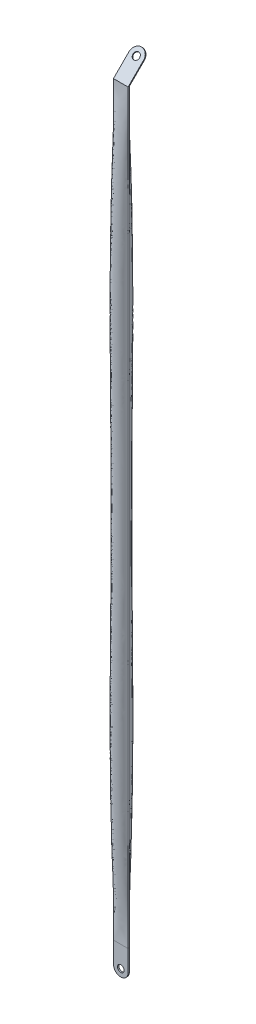
ISO-10303-21;
HEADER;
FILE_DESCRIPTION(('STEP AP214'),'2;1');
FILE_NAME('part.step','',(''),(''),'','','');
FILE_SCHEMA(('AUTOMOTIVE_DESIGN { 1 0 10303 214 1 1 1 1 }'));
ENDSEC;
DATA;
#1=APPLICATION_CONTEXT('core data for automotive mechanical design processes');
#2=APPLICATION_PROTOCOL_DEFINITION('international standard','automotive_design',2000,#1);
#3=PRODUCT_CONTEXT('',#1,'mechanical');
#4=PRODUCT('Part','Part','',(#3));
#5=PRODUCT_RELATED_PRODUCT_CATEGORY('part','',(#4));
#6=PRODUCT_DEFINITION_FORMATION('','',#4);
#7=PRODUCT_DEFINITION_CONTEXT('part definition',#1,'design');
#8=PRODUCT_DEFINITION('design','',#6,#7);
#9=PRODUCT_DEFINITION_SHAPE('','',#8);
#10=(LENGTH_UNIT() NAMED_UNIT(*) SI_UNIT(.MILLI.,.METRE.));
#11=(NAMED_UNIT(*) PLANE_ANGLE_UNIT() SI_UNIT($,.RADIAN.));
#12=(NAMED_UNIT(*) SI_UNIT($,.STERADIAN.) SOLID_ANGLE_UNIT());
#13=UNCERTAINTY_MEASURE_WITH_UNIT(LENGTH_MEASURE(1.E-05),#10,'distance_accuracy_value','');
#14=(GEOMETRIC_REPRESENTATION_CONTEXT(3) GLOBAL_UNCERTAINTY_ASSIGNED_CONTEXT((#13)) GLOBAL_UNIT_ASSIGNED_CONTEXT((#10,
#11,#12)) REPRESENTATION_CONTEXT('',''));
#15=CARTESIAN_POINT('',(0.,0.,0.));
#16=DIRECTION('',(0.,0.,1.));
#17=DIRECTION('',(1.,0.,0.));
#18=AXIS2_PLACEMENT_3D('',#15,#16,#17);
#19=CARTESIAN_POINT('',(13.97,711.2,-1.27));
#20=DIRECTION('',(0.,0.707107163928253,0.707106398444635));
#21=DIRECTION('',(0.,-0.707106398444635,0.707107163928253));
#22=AXIS2_PLACEMENT_3D('',#19,#20,#21);
#23=PLANE('',#22);
#24=DIRECTION('',(0.,0.707106398444635,-0.707107163928253));
#25=VECTOR('',#24,1.);
#26=CARTESIAN_POINT('',(-13.97,711.2,-1.27));
#27=LINE('',#26,#25);
#28=CARTESIAN_POINT('',(-13.97,711.2,-1.27));
#29=VERTEX_POINT('',#28);
#30=CARTESIAN_POINT('',(-13.97,739.487757606119,-29.5577882292547));
#31=VERTEX_POINT('',#30);
#32=EDGE_CURVE('E241',#29,#31,#27,.T.);
#33=ORIENTED_EDGE('',*,*,#32,.T.);
#34=CARTESIAN_POINT('',(0.,739.487757606119,-29.5577882292547));
#35=DIRECTION('',(0.,0.707107163928253,0.707106398444635));
#36=DIRECTION('',(0.,-0.707106398444635,0.707107163928253));
#37=AXIS2_PLACEMENT_3D('',#34,#35,#36);
#38=ELLIPSE('',#37,13.9700478904708,13.97);
#39=CARTESIAN_POINT('',(0.,749.366067856049,-39.4361091730274));
#40=VERTEX_POINT('',#39);
#41=EDGE_CURVE('E124',#31,#40,#38,.F.);
#42=ORIENTED_EDGE('',*,*,#41,.T.);
#43=CARTESIAN_POINT('',(0.,739.487757606119,-29.5577882292546));
#44=DIRECTION('',(0.,0.707107163928253,0.707106398444635));
#45=DIRECTION('',(0.,0.707106398444635,-0.707107163928253));
#46=AXIS2_PLACEMENT_3D('',#43,#44,#45);
#47=ELLIPSE('',#46,13.9700478904708,13.97);
#48=CARTESIAN_POINT('',(13.97,739.487757606119,-29.5577882292546));
#49=VERTEX_POINT('',#48);
#50=EDGE_CURVE('E132',#40,#49,#47,.F.);
#51=ORIENTED_EDGE('',*,*,#50,.T.);
#52=DIRECTION('',(0.,0.707106398444635,-0.707107163928253));
#53=VECTOR('',#52,1.);
#54=CARTESIAN_POINT('',(13.97,711.2,-1.27));
#55=LINE('',#54,#53);
#56=CARTESIAN_POINT('',(13.97,711.2,-1.27));
#57=VERTEX_POINT('',#56);
#58=EDGE_CURVE('E200',#57,#49,#55,.T.);
#59=ORIENTED_EDGE('',*,*,#58,.F.);
#60=DIRECTION('',(-1.,0.,0.));
#61=VECTOR('',#60,1.);
#62=CARTESIAN_POINT('',(13.97,711.2,-1.27));
#63=LINE('',#62,#61);
#64=CARTESIAN_POINT('',(13.9121529606312,711.2,-1.27));
#65=VERTEX_POINT('',#64);
#66=EDGE_CURVE('E205',#57,#65,#63,.T.);
#67=ORIENTED_EDGE('',*,*,#66,.T.);
#68=DIRECTION('',(-1.,0.,0.));
#69=VECTOR('',#68,1.);
#70=CARTESIAN_POINT('',(-13.9121529606312,711.2,-1.27));
#71=LINE('',#70,#69);
#72=CARTESIAN_POINT('',(-13.9121529606312,711.2,-1.27));
#73=VERTEX_POINT('',#72);
#74=EDGE_CURVE('E313',#65,#73,#71,.T.);
#75=ORIENTED_EDGE('',*,*,#74,.T.);
#76=EDGE_CURVE('E223',#73,#29,#63,.T.);
#77=ORIENTED_EDGE('',*,*,#76,.T.);
#78=EDGE_LOOP('',(#33,#42,#51,#59,#67,#75,#77));
#79=FACE_BOUND('',#78,.T.);
#80=CARTESIAN_POINT('',(0.,739.487757606119,-29.5577882292548));
#81=DIRECTION('',(0.,-0.707107163928253,-0.707106398444635));
#82=DIRECTION('',(0.,0.707106398444635,-0.707107163928253));
#83=AXIS2_PLACEMENT_3D('',#80,#81,#82);
#84=CIRCLE('',#83,6.34999999999999);
#85=CARTESIAN_POINT('',(0.,743.977883236243,-34.0479187201992));
#86=VERTEX_POINT('',#85);
#87=EDGE_CURVE('E252',#86,#86,#84,.T.);
#88=ORIENTED_EDGE('',*,*,#87,.F.);
#89=EDGE_LOOP('',(#88));
#90=FACE_BOUND('',#89,.T.);
#91=ADVANCED_FACE('F115',(#79,#90),#23,.F.);
#92=CARTESIAN_POINT('',(-13.9121529606312,711.2,1.27));
#93=CARTESIAN_POINT('',(-13.9116479341317,643.466666666667,1.269953897599));
#94=CARTESIAN_POINT('',(-13.9109754693789,406.509237608537,1.26989251024663));
#95=CARTESIAN_POINT('',(-13.9125902601457,3.54231790384775E-06,1.27003991980141));
#96=CARTESIAN_POINT('',(-13.9121058426015,-406.509251500024,1.26999569873203));
#97=CARTESIAN_POINT('',(-13.9121529606312,-643.466666666667,1.27));
#98=CARTESIAN_POINT('',(-13.9121529606312,-711.2,1.27));
#99=CARTESIAN_POINT('',(-13.9121529606312,711.2,0.423333333333333));
#100=CARTESIAN_POINT('',(-13.9116479341317,643.466666666667,0.423317965866331));
#101=CARTESIAN_POINT('',(-14.0844634993859,406.509237608537,0.427206810558342));
#102=CARTESIAN_POINT('',(-13.9209011456877,3.54231790384775E-06,0.423533913973461));
#103=CARTESIAN_POINT('',(-14.0856033635069,-406.509251500024,0.427241420584099));
#104=CARTESIAN_POINT('',(-13.9121529606312,-643.466666666667,0.42333333333333));
#105=CARTESIAN_POINT('',(-13.9121529606312,-711.2,0.423333333333333));
#106=CARTESIAN_POINT('',(-13.9121529606312,711.2,-0.423333333333333));
#107=CARTESIAN_POINT('',(-13.9116479341317,643.466666666667,-0.423317965866341));
#108=CARTESIAN_POINT('',(-14.0844634993859,406.509237608537,-0.427206810558368));
#109=CARTESIAN_POINT('',(-13.9209011456877,3.54231790384775E-06,-0.423533913973471));
#110=CARTESIAN_POINT('',(-14.0856033635069,-406.509251500024,-0.427241420584131));
#111=CARTESIAN_POINT('',(-13.9121529606312,-643.466666666667,-0.423333333333336));
#112=CARTESIAN_POINT('',(-13.9121529606312,-711.2,-0.423333333333333));
#113=CARTESIAN_POINT('',(-13.9121529606312,711.2,-1.27));
#114=CARTESIAN_POINT('',(-13.9116479341317,643.466666666667,-1.26995389759901));
#115=CARTESIAN_POINT('',(-13.9109754693789,406.509237608537,-1.26989251024665));
#116=CARTESIAN_POINT('',(-13.9125902601457,3.54231790384775E-06,-1.27003991980142));
#117=CARTESIAN_POINT('',(-13.9121058426015,-406.509251500024,-1.26999569873206));
#118=CARTESIAN_POINT('',(-13.9121529606312,-643.466666666667,-1.27));
#119=CARTESIAN_POINT('',(-13.9121529606312,-711.2,-1.27));
#120=B_SPLINE_SURFACE_WITH_KNOTS('',3,3,((#92,#93,#94,#95,#96,#97,#98),(#99,#100,#101,#102,#103,
#104,#105),(#106,#107,#108,#109,#110,#111,#112),(#113,#114,#115,#116,#117,#118,#119)),
.UNSPECIFIED.,.F.,.F.,.F.,(4,4),(4,1,1,1,4),(0.,1.),(0.,0.142906905830526,0.499999995812319,
0.857093085793712,1.),.UNSPECIFIED.);
#121=DIRECTION('',(0.,0.,1.));
#122=VECTOR('',#121,1.);
#123=CARTESIAN_POINT('',(-13.9121529606312,711.2,-1.27));
#124=LINE('',#123,#122);
#125=CARTESIAN_POINT('',(-13.9121529606312,711.2,1.27));
#126=VERTEX_POINT('',#125);
#127=EDGE_CURVE('E305',#73,#126,#124,.T.);
#128=CARTESIAN_POINT('',(-13.9121529606312,711.2,-1.27));
#129=CARTESIAN_POINT('',(-13.9116479341317,643.466666666667,-1.26995389759901));
#130=CARTESIAN_POINT('',(-13.9109754693789,406.509237608537,-1.26989251024665));
#131=CARTESIAN_POINT('',(-13.9125902601457,3.54231790384775E-06,-1.27003991980142));
#132=CARTESIAN_POINT('',(-13.9121058426015,-406.509251500024,-1.26999569873206));
#133=CARTESIAN_POINT('',(-13.9121529606312,-643.466666666667,-1.27));
#134=CARTESIAN_POINT('',(-13.9121529606312,-711.2,-1.27));
#135=B_SPLINE_CURVE_WITH_KNOTS('',3,(#128,#129,#130,#131,#132,#133,#134),.UNSPECIFIED.,.F.,.F.,
(4,1,1,1,4),(0.,0.142906905830526,0.499999995812319,0.857093085793712,1.),.UNSPECIFIED.);
#136=CARTESIAN_POINT('',(-13.9121529606312,-711.2,-1.27));
#137=VERTEX_POINT('',#136);
#138=EDGE_CURVE('E474',#73,#137,#135,.T.);
#139=DIRECTION('',(0.,0.,1.));
#140=VECTOR('',#139,1.);
#141=CARTESIAN_POINT('',(-13.9121529606312,-711.2,-1.27));
#142=LINE('',#141,#140);
#143=CARTESIAN_POINT('',(-13.9121529606312,-711.2,1.27));
#144=VERTEX_POINT('',#143);
#145=EDGE_CURVE('E338',#137,#144,#142,.T.);
#146=CARTESIAN_POINT('',(-13.9121529606312,711.2,1.27));
#147=CARTESIAN_POINT('',(-13.9116479341317,643.466666666667,1.269953897599));
#148=CARTESIAN_POINT('',(-13.9109754693789,406.509237608537,1.26989251024663));
#149=CARTESIAN_POINT('',(-13.9125902601457,3.54231790384775E-06,1.27003991980141));
#150=CARTESIAN_POINT('',(-13.9121058426015,-406.509251500024,1.26999569873203));
#151=CARTESIAN_POINT('',(-13.9121529606312,-643.466666666667,1.27));
#152=CARTESIAN_POINT('',(-13.9121529606312,-711.2,1.27));
#153=B_SPLINE_CURVE_WITH_KNOTS('',3,(#146,#147,#148,#149,#150,#151,#152),.UNSPECIFIED.,.F.,.F.,
(4,1,1,1,4),(0.,0.142906905830526,0.499999995812319,0.857093085793712,1.),.UNSPECIFIED.);
#154=EDGE_CURVE('E472',#144,#126,#153,.F.);
#155=ORIENTED_EDGE('',*,*,#127,.F.);
#156=ORIENTED_EDGE('',*,*,#138,.T.);
#157=ORIENTED_EDGE('',*,*,#145,.T.);
#158=ORIENTED_EDGE('',*,*,#154,.T.);
#159=EDGE_LOOP('',(#155,#156,#157,#158));
#160=FACE_BOUND('',#159,.T.);
#161=ADVANCED_FACE('F273',(#160),#120,.T.);
#162=CARTESIAN_POINT('',(-13.9121529606312,711.2,-1.27));
#163=CARTESIAN_POINT('',(-13.9116479341316,643.466666666667,-1.26995389759901));
#164=CARTESIAN_POINT('',(-13.9109754693789,406.509237608537,-1.26989251024666));
#165=CARTESIAN_POINT('',(-13.9125902601457,3.54231790384775E-06,-1.27003991980142));
#166=CARTESIAN_POINT('',(-13.9121058426015,-406.509251500024,-1.26999569873207));
#167=CARTESIAN_POINT('',(-13.9121529606312,-643.466666666667,-1.27));
#168=CARTESIAN_POINT('',(-13.9121529606312,-711.2,-1.27));
#169=CARTESIAN_POINT('',(-13.3324799206049,711.2,-1.27));
#170=CARTESIAN_POINT('',(-13.588640023155,643.467275193675,-1.77480924872905));
#171=CARTESIAN_POINT('',(-14.1300094772465,406.508535836901,-2.66054627872622));
#172=CARTESIAN_POINT('',(-13.6155291907139,3.44336746860093E-06,-1.81737067585328));
#173=CARTESIAN_POINT('',(-14.1311351985051,-406.508549451282,-2.66072309618724));
#174=CARTESIAN_POINT('',(-13.5891403114929,-643.467275415506,-1.77488742463549));
#175=CARTESIAN_POINT('',(-13.3324799206049,-711.2,-1.27));
#176=CARTESIAN_POINT('',(-12.1731338405523,711.2,-1.27));
#177=CARTESIAN_POINT('',(-12.9426242012017,643.468492247693,-2.78451995098911));
#178=CARTESIAN_POINT('',(-14.190361491263,406.507132293629,-5.32382139157622));
#179=CARTESIAN_POINT('',(-13.0033126942305,3.2454682557575E-06,-2.9063778845046));
#180=CARTESIAN_POINT('',(-14.1914572451265,-406.507145353801,-5.32413900986431));
#181=CARTESIAN_POINT('',(-12.9431150132164,-643.468492913185,-2.78466227390647));
#182=CARTESIAN_POINT('',(-12.1731338405523,-711.2,-1.27));
#183=CARTESIAN_POINT('',(-10.4341147204734,711.2,-1.27));
#184=CARTESIAN_POINT('',(-11.6358687289977,643.476175670171,-4.15932085958257));
#185=CARTESIAN_POINT('',(-13.6771012937555,406.498271443221,-9.03827496271544));
#186=CARTESIAN_POINT('',(-11.7344830811231,2.89324955289174E-06,-4.39337215740716));
#187=CARTESIAN_POINT('',(-13.6781207051083,-406.498283516957,-9.03878912108418));
#188=CARTESIAN_POINT('',(-11.636323869026,-643.476177125682,-4.15955052038327));
#189=CARTESIAN_POINT('',(-10.4341147204734,-711.2,-1.27));
#190=CARTESIAN_POINT('',(-8.69509560039451,711.2,-1.27));
#191=CARTESIAN_POINT('',(-10.1186592439269,643.485741933892,-5.39925015185715));
#192=CARTESIAN_POINT('',(-12.5170428538923,406.487239210684,-12.3651719815599));
#193=CARTESIAN_POINT('',(-10.2342792198375,2.5413497868734E-06,-5.73337893250273));
#194=CARTESIAN_POINT('',(-12.5179515589038,-406.487250298855,-12.3658621324137));
#195=CARTESIAN_POINT('',(-10.1190653423176,-643.485744178843,-5.39955858208018));
#196=CARTESIAN_POINT('',(-8.69509560039451,-711.2,-1.27));
#197=CARTESIAN_POINT('',(-6.95607648031561,711.200000000001,-1.27));
#198=CARTESIAN_POINT('',(-8.39038855290233,643.49618637986,-6.47047687390227));
#199=CARTESIAN_POINT('',(-10.8116432108543,406.475194214411,-15.2457971165389));
#200=CARTESIAN_POINT('',(-8.50698321997328,2.20972998559942E-06,-6.8913723953864));
#201=CARTESIAN_POINT('',(-10.812412398917,-406.475204373799,-15.2466396636576));
#202=CARTESIAN_POINT('',(-8.39073220148718,-643.496189368859,-6.47085335633062));
#203=CARTESIAN_POINT('',(-6.95607648031561,-711.200000000001,-1.27));
#204=CARTESIAN_POINT('',(-5.21705736023671,711.2,-1.27));
#205=CARTESIAN_POINT('',(-6.49087437729345,643.506002594468,-7.34957235937284));
#206=CARTESIAN_POINT('',(-8.64018651323532,406.463873719688,-17.6084384840391));
#207=CARTESIAN_POINT('',(-6.59430670428217,1.92213801700461E-06,-7.84160896138948));
#208=CARTESIAN_POINT('',(-8.64079151796446,-406.463883073596,-17.6094060212067));
#209=CARTESIAN_POINT('',(-6.49114469752955,-643.506006228785,-7.35000468882576));
#210=CARTESIAN_POINT('',(-5.21705736023671,-711.2,-1.27));
#211=CARTESIAN_POINT('',(-3.47803824015781,711.2,-1.27));
#212=CARTESIAN_POINT('',(-4.43759994447708,643.514048645028,-8.01033654385392));
#213=CARTESIAN_POINT('',(-6.05700676007797,406.454594655374,-19.3848467676251));
#214=CARTESIAN_POINT('',(-4.51549966205704,1.69942202399646E-06,-8.555872055572));
#215=CARTESIAN_POINT('',(-6.05742580291058,-406.454603385499,-19.385908282066));
#216=CARTESIAN_POINT('',(-4.43778716835628,-643.514052779122,-8.0108108506259));
#217=CARTESIAN_POINT('',(-3.47803824015781,-711.2,-1.27));
#218=CARTESIAN_POINT('',(-1.7390191200789,711.2,-1.27));
#219=CARTESIAN_POINT('',(-2.2757915409969,643.519378741883,-8.42731609418569));
#220=CARTESIAN_POINT('',(-3.18164698480944,406.448447749438,-20.5058396895833));
#221=CARTESIAN_POINT('',(-2.31935221885815,1.55699389800974E-06,-9.00661143047074));
#222=CARTESIAN_POINT('',(-3.18186460782621,-406.44845608065,-20.5069605075642));
#223=CARTESIAN_POINT('',(-2.27588877353831,-643.5193831956,-8.42781689125835));
#224=CARTESIAN_POINT('',(-1.7390191200789,-711.2,-1.27));
#225=CARTESIAN_POINT('',(0.,711.199999999999,-1.27));
#226=CARTESIAN_POINT('',(0.,643.52127291809,-8.5748497938438));
#227=CARTESIAN_POINT('',(0.,406.446263300556,-20.9024947003553));
#228=CARTESIAN_POINT('',(0.,1.50836677876446E-06,-9.16609133892898));
#229=CARTESIAN_POINT('',(0.,-406.446271495571,-20.9036365024024));
#230=CARTESIAN_POINT('',(0.,-643.521277480937,-8.57535996367908));
#231=CARTESIAN_POINT('',(0.,-711.199999999999,-1.27));
#232=CARTESIAN_POINT('',(1.7390191200789,711.199999999999,-1.27));
#233=CARTESIAN_POINT('',(2.27579154099693,643.519378741883,-8.42731609418568));
#234=CARTESIAN_POINT('',(3.1816469848095,406.448447749439,-20.5058396895832));
#235=CARTESIAN_POINT('',(2.31935221885814,1.55699404645602E-06,-9.00661143047077));
#236=CARTESIAN_POINT('',(3.18186460782624,-406.44845608065,-20.5069605075642));
#237=CARTESIAN_POINT('',(2.27588877353831,-643.5193831956,-8.42781689125836));
#238=CARTESIAN_POINT('',(1.7390191200789,-711.199999999999,-1.27));
#239=CARTESIAN_POINT('',(3.47803824015781,711.2,-1.27));
#240=CARTESIAN_POINT('',(4.43759994447708,643.514048645028,-8.01033654385393));
#241=CARTESIAN_POINT('',(6.05700676007796,406.454594655373,-19.3848467676252));
#242=CARTESIAN_POINT('',(4.51549966205706,1.69942222192484E-06,-8.55587205557197));
#243=CARTESIAN_POINT('',(6.0574258029106,-406.4546033855,-19.385908282066));
#244=CARTESIAN_POINT('',(4.43778716835629,-643.514052779122,-8.01081085062589));
#245=CARTESIAN_POINT('',(3.47803824015781,-711.2,-1.27));
#246=CARTESIAN_POINT('',(5.21705736023671,711.2,-1.27));
#247=CARTESIAN_POINT('',(6.49087437729346,643.506002594468,-7.34957235937281));
#248=CARTESIAN_POINT('',(8.64018651323536,406.463873719688,-17.608438484039));
#249=CARTESIAN_POINT('',(6.59430670428217,1.92213821493299E-06,-7.8416089613895));
#250=CARTESIAN_POINT('',(8.64079151796448,-406.463883073597,-17.6094060212067));
#251=CARTESIAN_POINT('',(6.49114469752956,-643.506006228784,-7.35000468882576));
#252=CARTESIAN_POINT('',(5.21705736023671,-711.2,-1.27));
#253=CARTESIAN_POINT('',(6.95607648031562,711.2,-1.27));
#254=CARTESIAN_POINT('',(8.39038855290234,643.496186379861,-6.47047687390229));
#255=CARTESIAN_POINT('',(10.8116432108543,406.475194214411,-15.2457971165389));
#256=CARTESIAN_POINT('',(8.5069832199733,2.20973035671514E-06,-6.89137239538634));
#257=CARTESIAN_POINT('',(10.812412398917,-406.475204373801,-15.2466396636575));
#258=CARTESIAN_POINT('',(8.3907322014872,-643.496189368858,-6.4708533563306));
#259=CARTESIAN_POINT('',(6.95607648031561,-711.2,-1.27));
#260=CARTESIAN_POINT('',(8.69509560039451,711.200000000001,-1.27));
#261=CARTESIAN_POINT('',(10.1186592439269,643.485741933892,-5.39925015185712));
#262=CARTESIAN_POINT('',(12.5170428538924,406.487239210682,-12.3651719815598));
#263=CARTESIAN_POINT('',(10.2342792198375,2.5413498858376E-06,-5.73337893250279));
#264=CARTESIAN_POINT('',(12.5179515589039,-406.487250298853,-12.3658621324137));
#265=CARTESIAN_POINT('',(10.1190653423176,-643.485744178843,-5.39955858208019));
#266=CARTESIAN_POINT('',(8.69509560039451,-711.200000000001,-1.27));
#267=CARTESIAN_POINT('',(10.4341147204734,711.2,-1.27));
#268=CARTESIAN_POINT('',(11.6358687289977,643.476175670172,-4.15932085958258));
#269=CARTESIAN_POINT('',(13.6771012937555,406.498271443222,-9.03827496271548));
#270=CARTESIAN_POINT('',(11.7344830811232,2.89324989926641E-06,-4.39337215740709));
#271=CARTESIAN_POINT('',(13.6781207051083,-406.498283516958,-9.0387891210841));
#272=CARTESIAN_POINT('',(11.636323869026,-643.476177125682,-4.15955052038325));
#273=CARTESIAN_POINT('',(10.4341147204734,-711.2,-1.27));
#274=CARTESIAN_POINT('',(12.1731338405523,711.2,-1.27));
#275=CARTESIAN_POINT('',(12.9426242012017,643.468492247692,-2.78451995098908));
#276=CARTESIAN_POINT('',(14.190361491263,406.507132293628,-5.32382139157615));
#277=CARTESIAN_POINT('',(13.0033126942305,3.24546795886492E-06,-2.90637788450463));
#278=CARTESIAN_POINT('',(14.1914572451265,-406.507145353799,-5.32413900986433));
#279=CARTESIAN_POINT('',(12.9431150132164,-643.468492913185,-2.78466227390647));
#280=CARTESIAN_POINT('',(12.1731338405523,-711.2,-1.27));
#281=CARTESIAN_POINT('',(13.3324799206049,711.2,-1.27));
#282=CARTESIAN_POINT('',(13.588640023155,643.467275193675,-1.77480924872903));
#283=CARTESIAN_POINT('',(14.1300094772466,406.508535836901,-2.66054627872622));
#284=CARTESIAN_POINT('',(13.6155291907139,3.44336759230617E-06,-1.81737067585327));
#285=CARTESIAN_POINT('',(14.1311351985051,-406.508549451282,-2.66072309618722));
#286=CARTESIAN_POINT('',(13.5891403114929,-643.467275415506,-1.77488742463549));
#287=CARTESIAN_POINT('',(13.3324799206049,-711.2,-1.27));
#288=CARTESIAN_POINT('',(13.9121529606312,711.2,-1.27));
#289=CARTESIAN_POINT('',(13.9116479341317,643.466666666667,-1.26995389759901));
#290=CARTESIAN_POINT('',(13.9109754693789,406.509237608537,-1.26989251024664));
#291=CARTESIAN_POINT('',(13.9125902601457,3.54231790384775E-06,-1.27003991980141));
#292=CARTESIAN_POINT('',(13.9121058426015,-406.509251500024,-1.26999569873205));
#293=CARTESIAN_POINT('',(13.9121529606312,-643.466666666667,-1.27));
#294=CARTESIAN_POINT('',(13.9121529606312,-711.2,-1.27));
#295=B_SPLINE_SURFACE_WITH_KNOTS('',3,3,((#162,#163,#164,#165,#166,#167,#168),(#169,#170,#171,
#172,#173,#174,#175),(#176,#177,#178,#179,#180,#181,#182),(#183,#184,#185,#186,#187,#188,#189),
(#190,#191,#192,#193,#194,#195,#196),(#197,#198,#199,#200,#201,#202,#203),(#204,#205,#206,#207,
#208,#209,#210),(#211,#212,#213,#214,#215,#216,#217),(#218,#219,#220,#221,#222,#223,#224),(#225,
#226,#227,#228,#229,#230,#231),(#232,#233,#234,#235,#236,#237,#238),(#239,#240,#241,#242,#243,
#244,#245),(#246,#247,#248,#249,#250,#251,#252),(#253,#254,#255,#256,#257,#258,#259),(#260,#261,
#262,#263,#264,#265,#266),(#267,#268,#269,#270,#271,#272,#273),(#274,#275,#276,#277,#278,#279,
#280),(#281,#282,#283,#284,#285,#286,#287),(#288,#289,#290,#291,#292,#293,#294)),.UNSPECIFIED.,
.F.,.F.,.F.,(4,1,1,1,1,1,1,1,1,1,1,1,1,1,1,1,4),(4,1,1,1,4),(0.,0.0625,0.125,0.1875,0.25,0.3125,
0.375,0.4375,0.5,0.5625,0.625,0.6875,0.75,0.8125,0.875,0.9375,1.),(0.,0.142906905830526,
0.499999995812319,0.857093085793712,1.),.UNSPECIFIED.);
#296=CARTESIAN_POINT('',(13.9121529606312,711.2,-1.27));
#297=CARTESIAN_POINT('',(13.9116479341317,643.466666666667,-1.26995389759901));
#298=CARTESIAN_POINT('',(13.9109754693789,406.509237608537,-1.26989251024664));
#299=CARTESIAN_POINT('',(13.9125902601457,3.54231790384775E-06,-1.27003991980141));
#300=CARTESIAN_POINT('',(13.9121058426015,-406.509251500024,-1.26999569873205));
#301=CARTESIAN_POINT('',(13.9121529606312,-643.466666666667,-1.27));
#302=CARTESIAN_POINT('',(13.9121529606312,-711.2,-1.27));
#303=B_SPLINE_CURVE_WITH_KNOTS('',3,(#296,#297,#298,#299,#300,#301,#302),.UNSPECIFIED.,.F.,.F.,
(4,1,1,1,4),(0.,0.142906905830526,0.499999995812319,0.857093085793712,1.),.UNSPECIFIED.);
#304=CARTESIAN_POINT('',(13.9121529606312,-711.2,-1.27));
#305=VERTEX_POINT('',#304);
#306=EDGE_CURVE('E479',#65,#305,#303,.T.);
#307=DIRECTION('',(-1.,0.,0.));
#308=VECTOR('',#307,1.);
#309=CARTESIAN_POINT('',(-13.9121529606312,-711.2,-1.27));
#310=LINE('',#309,#308);
#311=EDGE_CURVE('E333',#305,#137,#310,.T.);
#312=ORIENTED_EDGE('',*,*,#74,.F.);
#313=ORIENTED_EDGE('',*,*,#306,.T.);
#314=ORIENTED_EDGE('',*,*,#311,.T.);
#315=ORIENTED_EDGE('',*,*,#138,.F.);
#316=EDGE_LOOP('',(#312,#313,#314,#315));
#317=FACE_BOUND('',#316,.T.);
#318=ADVANCED_FACE('F278',(#317),#295,.T.);
#319=CARTESIAN_POINT('',(13.9121529606312,711.2,1.27));
#320=CARTESIAN_POINT('',(13.9116479341317,643.466666666667,1.26995389759901));
#321=CARTESIAN_POINT('',(13.9109754693789,406.509237608537,1.26989251024664));
#322=CARTESIAN_POINT('',(13.9125902601457,3.54231790384775E-06,1.27003991980141));
#323=CARTESIAN_POINT('',(13.9121058426015,-406.509251500024,1.26999569873204));
#324=CARTESIAN_POINT('',(13.9121529606312,-643.466666666667,1.27));
#325=CARTESIAN_POINT('',(13.9121529606312,-711.2,1.27));
#326=CARTESIAN_POINT('',(13.3324799206049,711.2,1.27));
#327=CARTESIAN_POINT('',(13.588640023155,643.467275193675,1.77480924872904));
#328=CARTESIAN_POINT('',(14.1300094772465,406.508535836901,2.6605462787262));
#329=CARTESIAN_POINT('',(13.6155291907139,3.44336746860093E-06,1.81737067585327));
#330=CARTESIAN_POINT('',(14.1311351985051,-406.508549451282,2.66072309618722));
#331=CARTESIAN_POINT('',(13.589140311493,-643.467275415506,1.77488742463549));
#332=CARTESIAN_POINT('',(13.3324799206049,-711.2,1.27));
#333=CARTESIAN_POINT('',(12.1731338405523,711.2,1.27));
#334=CARTESIAN_POINT('',(12.9426242012017,643.468492247693,2.7845199509891));
#335=CARTESIAN_POINT('',(14.190361491263,406.507132293629,5.32382139157619));
#336=CARTESIAN_POINT('',(13.0033126942306,3.2454682557575E-06,2.9063778845046));
#337=CARTESIAN_POINT('',(14.1914572451265,-406.507145353801,5.3241390098643));
#338=CARTESIAN_POINT('',(12.9431150132164,-643.468492913185,2.78466227390646));
#339=CARTESIAN_POINT('',(12.1731338405523,-711.2,1.27));
#340=CARTESIAN_POINT('',(10.4341147204734,711.2,1.27));
#341=CARTESIAN_POINT('',(11.6358687289977,643.476175670171,4.15932085958256));
#342=CARTESIAN_POINT('',(13.6771012937555,406.498271443221,9.03827496271543));
#343=CARTESIAN_POINT('',(11.7344830811231,2.89324955289174E-06,4.39337215740715));
#344=CARTESIAN_POINT('',(13.6781207051083,-406.498283516957,9.03878912108415));
#345=CARTESIAN_POINT('',(11.636323869026,-643.476177125682,4.15955052038326));
#346=CARTESIAN_POINT('',(10.4341147204734,-711.2,1.27));
#347=CARTESIAN_POINT('',(8.69509560039451,711.2,1.27));
#348=CARTESIAN_POINT('',(10.1186592439269,643.485741933892,5.39925015185715));
#349=CARTESIAN_POINT('',(12.5170428538924,406.487239210684,12.3651719815599));
#350=CARTESIAN_POINT('',(10.2342792198375,2.5413497868734E-06,5.73337893250274));
#351=CARTESIAN_POINT('',(12.5179515589039,-406.487250298855,12.3658621324137));
#352=CARTESIAN_POINT('',(10.1190653423177,-643.485744178843,5.39955858208018));
#353=CARTESIAN_POINT('',(8.69509560039451,-711.2,1.27));
#354=CARTESIAN_POINT('',(6.95607648031561,711.200000000001,1.27));
#355=CARTESIAN_POINT('',(8.39038855290232,643.49618637986,6.47047687390226));
#356=CARTESIAN_POINT('',(10.8116432108543,406.475194214411,15.2457971165389));
#357=CARTESIAN_POINT('',(8.50698321997329,2.20972998559942E-06,6.8913723953864));
#358=CARTESIAN_POINT('',(10.812412398917,-406.475204373799,15.2466396636575));
#359=CARTESIAN_POINT('',(8.39073220148719,-643.496189368859,6.47085335633062));
#360=CARTESIAN_POINT('',(6.95607648031561,-711.200000000001,1.27));
#361=CARTESIAN_POINT('',(5.21705736023671,711.2,1.27));
#362=CARTESIAN_POINT('',(6.49087437729346,643.506002594468,7.34957235937284));
#363=CARTESIAN_POINT('',(8.64018651323536,406.463873719688,17.6084384840391));
#364=CARTESIAN_POINT('',(6.59430670428217,1.92213801700461E-06,7.84160896138949));
#365=CARTESIAN_POINT('',(8.64079151796448,-406.463883073596,17.6094060212067));
#366=CARTESIAN_POINT('',(6.49114469752956,-643.506006228785,7.35000468882576));
#367=CARTESIAN_POINT('',(5.21705736023671,-711.2,1.27));
#368=CARTESIAN_POINT('',(3.47803824015781,711.2,1.27));
#369=CARTESIAN_POINT('',(4.43759994447707,643.514048645028,8.01033654385392));
#370=CARTESIAN_POINT('',(6.05700676007795,406.454594655374,19.3848467676251));
#371=CARTESIAN_POINT('',(4.51549966205705,1.69942202399646E-06,8.555872055572));
#372=CARTESIAN_POINT('',(6.05742580291059,-406.454603385499,19.385908282066));
#373=CARTESIAN_POINT('',(4.43778716835629,-643.514052779122,8.0108108506259));
#374=CARTESIAN_POINT('',(3.47803824015781,-711.2,1.27));
#375=CARTESIAN_POINT('',(1.73901912007891,711.2,1.27));
#376=CARTESIAN_POINT('',(2.27579154099691,643.519378741883,8.42731609418568));
#377=CARTESIAN_POINT('',(3.18164698480947,406.448447749438,20.5058396895832));
#378=CARTESIAN_POINT('',(2.31935221885814,1.55699389800974E-06,9.00661143047077));
#379=CARTESIAN_POINT('',(3.18186460782623,-406.44845608065,20.5069605075642));
#380=CARTESIAN_POINT('',(2.27588877353831,-643.5193831956,8.42781689125836));
#381=CARTESIAN_POINT('',(1.7390191200789,-711.2,1.27));
#382=CARTESIAN_POINT('',(0.,711.199999999999,1.27));
#383=CARTESIAN_POINT('',(0.,643.52127291809,8.57484979384381));
#384=CARTESIAN_POINT('',(0.,406.446263300557,20.9024947003553));
#385=CARTESIAN_POINT('',(0.,1.50836692721074E-06,9.16609133892896));
#386=CARTESIAN_POINT('',(0.,-406.446271495572,20.9036365024023));
#387=CARTESIAN_POINT('',(0.,-643.521277480937,8.57535996367907));
#388=CARTESIAN_POINT('',(0.,-711.199999999999,1.27));
#389=CARTESIAN_POINT('',(-1.7390191200789,711.199999999999,1.27));
#390=CARTESIAN_POINT('',(-2.27579154099692,643.519378741883,8.42731609418567));
#391=CARTESIAN_POINT('',(-3.18164698480948,406.448447749438,20.5058396895832));
#392=CARTESIAN_POINT('',(-2.31935221885814,1.55699402171497E-06,9.00661143047079));
#393=CARTESIAN_POINT('',(-3.18186460782623,-406.44845608065,20.5069605075642));
#394=CARTESIAN_POINT('',(-2.27588877353831,-643.519383195601,8.42781689125837));
#395=CARTESIAN_POINT('',(-1.7390191200789,-711.199999999999,1.27));
#396=CARTESIAN_POINT('',(-3.47803824015781,711.2,1.27));
#397=CARTESIAN_POINT('',(-4.43759994447708,643.514048645028,8.01033654385393));
#398=CARTESIAN_POINT('',(-6.05700676007798,406.454594655374,19.3848467676252));
#399=CARTESIAN_POINT('',(-4.51549966205705,1.69942241985323E-06,8.55587205557197));
#400=CARTESIAN_POINT('',(-6.05742580291061,-406.4546033855,19.385908282066));
#401=CARTESIAN_POINT('',(-4.43778716835629,-643.514052779121,8.01081085062589));
#402=CARTESIAN_POINT('',(-3.47803824015781,-711.2,1.27));
#403=CARTESIAN_POINT('',(-5.21705736023671,711.2,1.27));
#404=CARTESIAN_POINT('',(-6.49087437729345,643.506002594468,7.34957235937281));
#405=CARTESIAN_POINT('',(-8.64018651323533,406.463873719688,17.608438484039));
#406=CARTESIAN_POINT('',(-6.59430670428218,1.92213786855833E-06,7.84160896138951));
#407=CARTESIAN_POINT('',(-8.64079151796447,-406.463883073596,17.6094060212067));
#408=CARTESIAN_POINT('',(-6.49114469752956,-643.506006228785,7.35000468882577));
#409=CARTESIAN_POINT('',(-5.21705736023671,-711.2,1.27));
#410=CARTESIAN_POINT('',(-6.95607648031561,711.2,1.27));
#411=CARTESIAN_POINT('',(-8.39038855290235,643.496186379861,6.47047687390228));
#412=CARTESIAN_POINT('',(-10.8116432108544,406.475194214411,15.2457971165389));
#413=CARTESIAN_POINT('',(-8.5069832199733,2.20973035671514E-06,6.89137239538635));
#414=CARTESIAN_POINT('',(-10.8124123989171,-406.475204373801,15.2466396636575));
#415=CARTESIAN_POINT('',(-8.39073220148721,-643.496189368858,6.4708533563306));
#416=CARTESIAN_POINT('',(-6.95607648031561,-711.2,1.27));
#417=CARTESIAN_POINT('',(-8.69509560039451,711.200000000001,1.27));
#418=CARTESIAN_POINT('',(-10.1186592439269,643.485741933892,5.39925015185712));
#419=CARTESIAN_POINT('',(-12.5170428538924,406.487239210682,12.3651719815598));
#420=CARTESIAN_POINT('',(-10.2342792198375,2.5413498858376E-06,5.73337893250278));
#421=CARTESIAN_POINT('',(-12.5179515589039,-406.487250298853,12.3658621324137));
#422=CARTESIAN_POINT('',(-10.1190653423176,-643.485744178843,5.39955858208019));
#423=CARTESIAN_POINT('',(-8.69509560039451,-711.200000000001,1.27));
#424=CARTESIAN_POINT('',(-10.4341147204734,711.2,1.27));
#425=CARTESIAN_POINT('',(-11.6358687289977,643.476175670172,4.15932085958258));
#426=CARTESIAN_POINT('',(-13.6771012937555,406.498271443222,9.03827496271546));
#427=CARTESIAN_POINT('',(-11.7344830811232,2.89324989926641E-06,4.3933721574071));
#428=CARTESIAN_POINT('',(-13.6781207051083,-406.498283516958,9.03878912108411));
#429=CARTESIAN_POINT('',(-11.636323869026,-643.476177125682,4.15955052038325));
#430=CARTESIAN_POINT('',(-10.4341147204734,-711.2,1.27));
#431=CARTESIAN_POINT('',(-12.1731338405523,711.2,1.27));
#432=CARTESIAN_POINT('',(-12.9426242012017,643.468492247692,2.78451995098908));
#433=CARTESIAN_POINT('',(-14.190361491263,406.507132293628,5.32382139157615));
#434=CARTESIAN_POINT('',(-13.0033126942305,3.24546795886492E-06,2.90637788450462));
#435=CARTESIAN_POINT('',(-14.1914572451265,-406.507145353799,5.3241390098643));
#436=CARTESIAN_POINT('',(-12.9431150132164,-643.468492913185,2.78466227390646));
#437=CARTESIAN_POINT('',(-12.1731338405523,-711.2,1.27));
#438=CARTESIAN_POINT('',(-13.3324799206049,711.2,1.27));
#439=CARTESIAN_POINT('',(-13.588640023155,643.467275193675,1.77480924872903));
#440=CARTESIAN_POINT('',(-14.1300094772466,406.508535836901,2.6605462787262));
#441=CARTESIAN_POINT('',(-13.6155291907139,3.44336759230617E-06,1.81737067585327));
#442=CARTESIAN_POINT('',(-14.1311351985051,-406.508549451282,2.6607230961872));
#443=CARTESIAN_POINT('',(-13.5891403114929,-643.467275415506,1.77488742463549));
#444=CARTESIAN_POINT('',(-13.3324799206049,-711.2,1.27));
#445=CARTESIAN_POINT('',(-13.9121529606312,711.2,1.27));
#446=CARTESIAN_POINT('',(-13.9116479341316,643.466666666667,1.269953897599));
#447=CARTESIAN_POINT('',(-13.9109754693789,406.509237608537,1.26989251024663));
#448=CARTESIAN_POINT('',(-13.9125902601457,3.54231790384775E-06,1.27003991980141));
#449=CARTESIAN_POINT('',(-13.9121058426015,-406.509251500024,1.26999569873203));
#450=CARTESIAN_POINT('',(-13.9121529606312,-643.466666666667,1.27));
#451=CARTESIAN_POINT('',(-13.9121529606312,-711.2,1.27));
#452=B_SPLINE_SURFACE_WITH_KNOTS('',3,3,((#319,#320,#321,#322,#323,#324,#325),(#326,#327,#328,
#329,#330,#331,#332),(#333,#334,#335,#336,#337,#338,#339),(#340,#341,#342,#343,#344,#345,#346),
(#347,#348,#349,#350,#351,#352,#353),(#354,#355,#356,#357,#358,#359,#360),(#361,#362,#363,#364,
#365,#366,#367),(#368,#369,#370,#371,#372,#373,#374),(#375,#376,#377,#378,#379,#380,#381),(#382,
#383,#384,#385,#386,#387,#388),(#389,#390,#391,#392,#393,#394,#395),(#396,#397,#398,#399,#400,
#401,#402),(#403,#404,#405,#406,#407,#408,#409),(#410,#411,#412,#413,#414,#415,#416),(#417,#418,
#419,#420,#421,#422,#423),(#424,#425,#426,#427,#428,#429,#430),(#431,#432,#433,#434,#435,#436,
#437),(#438,#439,#440,#441,#442,#443,#444),(#445,#446,#447,#448,#449,#450,#451)),.UNSPECIFIED.,
.F.,.F.,.F.,(4,1,1,1,1,1,1,1,1,1,1,1,1,1,1,1,4),(4,1,1,1,4),(0.,0.0625,0.125,0.1875,0.25,0.3125,
0.375,0.4375,0.5,0.5625,0.625,0.6875,0.75,0.8125,0.875,0.9375,1.),(0.,0.142906905830526,
0.499999995812319,0.857093085793712,1.),.UNSPECIFIED.);
#453=DIRECTION('',(1.,0.,0.));
#454=VECTOR('',#453,1.);
#455=CARTESIAN_POINT('',(-13.9121529606312,711.2,1.27));
#456=LINE('',#455,#454);
#457=CARTESIAN_POINT('',(13.9121529606312,711.2,1.27));
#458=VERTEX_POINT('',#457);
#459=EDGE_CURVE('E301',#126,#458,#456,.T.);
#460=DIRECTION('',(1.,0.,0.));
#461=VECTOR('',#460,1.);
#462=CARTESIAN_POINT('',(-13.9121529606312,-711.2,1.27));
#463=LINE('',#462,#461);
#464=CARTESIAN_POINT('',(13.9121529606312,-711.2,1.27));
#465=VERTEX_POINT('',#464);
#466=EDGE_CURVE('E409',#144,#465,#463,.T.);
#467=CARTESIAN_POINT('',(13.9121529606312,711.2,1.27));
#468=CARTESIAN_POINT('',(13.9116479341317,643.466666666667,1.26995389759901));
#469=CARTESIAN_POINT('',(13.9109754693789,406.509237608537,1.26989251024664));
#470=CARTESIAN_POINT('',(13.9125902601457,3.54231790384775E-06,1.27003991980141));
#471=CARTESIAN_POINT('',(13.9121058426015,-406.509251500024,1.26999569873205));
#472=CARTESIAN_POINT('',(13.9121529606312,-643.466666666667,1.27));
#473=CARTESIAN_POINT('',(13.9121529606312,-711.2,1.27));
#474=B_SPLINE_CURVE_WITH_KNOTS('',3,(#467,#468,#469,#470,#471,#472,#473),.UNSPECIFIED.,.F.,.F.,
(4,1,1,1,4),(0.,0.142906905830526,0.499999995812319,0.857093085793712,1.),.UNSPECIFIED.);
#475=EDGE_CURVE('E537',#458,#465,#474,.T.);
#476=ORIENTED_EDGE('',*,*,#459,.F.);
#477=ORIENTED_EDGE('',*,*,#154,.F.);
#478=ORIENTED_EDGE('',*,*,#466,.T.);
#479=ORIENTED_EDGE('',*,*,#475,.F.);
#480=EDGE_LOOP('',(#476,#477,#478,#479));
#481=FACE_BOUND('',#480,.T.);
#482=ADVANCED_FACE('F476',(#481),#452,.T.);
#483=CARTESIAN_POINT('',(13.9121529606312,711.2,-1.27));
#484=CARTESIAN_POINT('',(13.9116479341317,643.466666666667,-1.26995389759901));
#485=CARTESIAN_POINT('',(13.9109754693789,406.509237608537,-1.26989251024664));
#486=CARTESIAN_POINT('',(13.9125902601457,3.54231790384775E-06,-1.27003991980141));
#487=CARTESIAN_POINT('',(13.9121058426015,-406.509251500024,-1.26999569873205));
#488=CARTESIAN_POINT('',(13.9121529606312,-643.466666666667,-1.27));
#489=CARTESIAN_POINT('',(13.9121529606312,-711.2,-1.27));
#490=CARTESIAN_POINT('',(13.9121529606312,711.2,-0.423333333333333));
#491=CARTESIAN_POINT('',(13.9116479341317,643.466666666667,-0.423317965866336));
#492=CARTESIAN_POINT('',(14.0844634993859,406.509237608537,-0.427206810558357));
#493=CARTESIAN_POINT('',(13.9209011456877,3.54231790384775E-06,-0.423533913973467));
#494=CARTESIAN_POINT('',(14.0856033635069,-406.509251500024,-0.427241420584117));
#495=CARTESIAN_POINT('',(13.9121529606312,-643.466666666667,-0.423333333333334));
#496=CARTESIAN_POINT('',(13.9121529606312,-711.2,-0.423333333333333));
#497=CARTESIAN_POINT('',(13.9121529606312,711.2,0.423333333333333));
#498=CARTESIAN_POINT('',(13.9116479341317,643.466666666667,0.423317965866336));
#499=CARTESIAN_POINT('',(14.0844634993859,406.509237608537,0.427206810558355));
#500=CARTESIAN_POINT('',(13.9209011456877,3.54231790384775E-06,0.423533913973466));
#501=CARTESIAN_POINT('',(14.0856033635069,-406.509251500024,0.427241420584114));
#502=CARTESIAN_POINT('',(13.9121529606312,-643.466666666667,0.423333333333333));
#503=CARTESIAN_POINT('',(13.9121529606312,-711.2,0.423333333333333));
#504=CARTESIAN_POINT('',(13.9121529606312,711.2,1.27));
#505=CARTESIAN_POINT('',(13.9116479341317,643.466666666667,1.26995389759901));
#506=CARTESIAN_POINT('',(13.9109754693789,406.509237608537,1.26989251024664));
#507=CARTESIAN_POINT('',(13.9125902601457,3.54231790384775E-06,1.27003991980141));
#508=CARTESIAN_POINT('',(13.9121058426015,-406.509251500024,1.26999569873205));
#509=CARTESIAN_POINT('',(13.9121529606312,-643.466666666667,1.27));
#510=CARTESIAN_POINT('',(13.9121529606312,-711.2,1.27));
#511=B_SPLINE_SURFACE_WITH_KNOTS('',3,3,((#483,#484,#485,#486,#487,#488,#489),(#490,#491,#492,
#493,#494,#495,#496),(#497,#498,#499,#500,#501,#502,#503),(#504,#505,#506,#507,#508,#509,#510)),
.UNSPECIFIED.,.F.,.F.,.F.,(4,4),(4,1,1,1,4),(0.,1.),(0.,0.142906905830526,0.499999995812319,
0.857093085793712,1.),.UNSPECIFIED.);
#512=DIRECTION('',(0.,0.,-1.));
#513=VECTOR('',#512,1.);
#514=CARTESIAN_POINT('',(13.9121529606312,711.2,-1.27));
#515=LINE('',#514,#513);
#516=EDGE_CURVE('E221',#458,#65,#515,.T.);
#517=DIRECTION('',(0.,0.,-1.));
#518=VECTOR('',#517,1.);
#519=CARTESIAN_POINT('',(13.9121529606312,-711.2,-1.27));
#520=LINE('',#519,#518);
#521=EDGE_CURVE('E346',#465,#305,#520,.T.);
#522=ORIENTED_EDGE('',*,*,#516,.F.);
#523=ORIENTED_EDGE('',*,*,#475,.T.);
#524=ORIENTED_EDGE('',*,*,#521,.T.);
#525=ORIENTED_EDGE('',*,*,#306,.F.);
#526=EDGE_LOOP('',(#522,#523,#524,#525));
#527=FACE_BOUND('',#526,.T.);
#528=ADVANCED_FACE('F369',(#527),#511,.T.);
#529=CARTESIAN_POINT('',(-13.9121529606312,-765.175,-1.27));
#530=DIRECTION('',(0.,0.,1.));
#531=DIRECTION('',(1.,0.,0.));
#532=AXIS2_PLACEMENT_3D('',#529,#530,#531);
#533=PLANE('',#532);
#534=CARTESIAN_POINT('',(0.0578470393687806,-751.205,-1.27));
#535=DIRECTION('',(0.,0.,-1.));
#536=DIRECTION('',(-1.,0.,0.));
#537=AXIS2_PLACEMENT_3D('',#534,#535,#536);
#538=CIRCLE('',#537,6.34999999999999);
#539=CARTESIAN_POINT('',(-6.29215296063121,-751.205,-1.27));
#540=VERTEX_POINT('',#539);
#541=EDGE_CURVE('E248',#540,#540,#538,.T.);
#542=ORIENTED_EDGE('',*,*,#541,.F.);
#543=EDGE_LOOP('',(#542));
#544=FACE_BOUND('',#543,.T.);
#545=CARTESIAN_POINT('',(-0.0578470393687806,-751.205,-1.27));
#546=DIRECTION('',(0.,0.,1.));
#547=DIRECTION('',(1.,0.,0.));
#548=AXIS2_PLACEMENT_3D('',#545,#546,#547);
#549=CIRCLE('',#548,13.97);
#550=CARTESIAN_POINT('',(13.9121529606312,-751.205,-1.27));
#551=VERTEX_POINT('',#550);
#552=CARTESIAN_POINT('',(0.,-765.174880232845,-1.27));
#553=VERTEX_POINT('',#552);
#554=EDGE_CURVE('E337',#551,#553,#549,.F.);
#555=ORIENTED_EDGE('',*,*,#554,.T.);
#556=CARTESIAN_POINT('',(0.0578470393687806,-751.205,-1.27));
#557=DIRECTION('',(0.,0.,1.));
#558=DIRECTION('',(1.,0.,0.));
#559=AXIS2_PLACEMENT_3D('',#556,#557,#558);
#560=CIRCLE('',#559,13.97);
#561=CARTESIAN_POINT('',(-13.9121529606312,-751.205,-1.27));
#562=VERTEX_POINT('',#561);
#563=EDGE_CURVE('E396',#553,#562,#560,.F.);
#564=ORIENTED_EDGE('',*,*,#563,.T.);
#565=DIRECTION('',(0.,1.,0.));
#566=VECTOR('',#565,1.);
#567=CARTESIAN_POINT('',(-13.9121529606312,-765.175,-1.27));
#568=LINE('',#567,#566);
#569=EDGE_CURVE('E226',#562,#137,#568,.T.);
#570=ORIENTED_EDGE('',*,*,#569,.T.);
#571=ORIENTED_EDGE('',*,*,#311,.F.);
#572=DIRECTION('',(0.,1.,0.));
#573=VECTOR('',#572,1.);
#574=CARTESIAN_POINT('',(13.9121529606312,-765.175,-1.27));
#575=LINE('',#574,#573);
#576=EDGE_CURVE('E317',#551,#305,#575,.T.);
#577=ORIENTED_EDGE('',*,*,#576,.F.);
#578=EDGE_LOOP('',(#555,#564,#570,#571,#577));
#579=FACE_BOUND('',#578,.T.);
#580=ADVANCED_FACE('F365',(#544,#579),#533,.F.);
#581=CARTESIAN_POINT('',(13.9121529606312,-765.175,-1.27));
#582=DIRECTION('',(-1.,0.,0.));
#583=DIRECTION('',(0.,0.,1.));
#584=AXIS2_PLACEMENT_3D('',#581,#582,#583);
#585=PLANE('',#584);
#586=DIRECTION('',(0.,1.,0.));
#587=VECTOR('',#586,1.);
#588=CARTESIAN_POINT('',(13.9121529606312,-765.175,1.27));
#589=LINE('',#588,#587);
#590=CARTESIAN_POINT('',(13.9121529606312,-751.205,1.27));
#591=VERTEX_POINT('',#590);
#592=EDGE_CURVE('E401',#591,#465,#589,.T.);
#593=ORIENTED_EDGE('',*,*,#592,.F.);
#594=DIRECTION('',(0.,0.,1.));
#595=VECTOR('',#594,1.);
#596=CARTESIAN_POINT('',(13.9121529606312,-751.205,-1.27));
#597=LINE('',#596,#595);
#598=EDGE_CURVE('E446',#591,#551,#597,.F.);
#599=ORIENTED_EDGE('',*,*,#598,.T.);
#600=ORIENTED_EDGE('',*,*,#576,.T.);
#601=ORIENTED_EDGE('',*,*,#521,.F.);
#602=EDGE_LOOP('',(#593,#599,#600,#601));
#603=FACE_BOUND('',#602,.T.);
#604=ADVANCED_FACE('F354',(#603),#585,.F.);
#605=CARTESIAN_POINT('',(13.9121529606312,-765.175,1.27));
#606=DIRECTION('',(0.,0.,-1.));
#607=DIRECTION('',(-1.,0.,0.));
#608=AXIS2_PLACEMENT_3D('',#605,#606,#607);
#609=PLANE('',#608);
#610=CARTESIAN_POINT('',(0.0578470393687806,-751.205,1.27));
#611=DIRECTION('',(0.,0.,-1.));
#612=DIRECTION('',(-1.,0.,0.));
#613=AXIS2_PLACEMENT_3D('',#610,#611,#612);
#614=CIRCLE('',#613,6.34999999999999);
#615=CARTESIAN_POINT('',(-6.29215296063121,-751.205,1.27));
#616=VERTEX_POINT('',#615);
#617=EDGE_CURVE('E251',#616,#616,#614,.T.);
#618=ORIENTED_EDGE('',*,*,#617,.T.);
#619=EDGE_LOOP('',(#618));
#620=FACE_BOUND('',#619,.T.);
#621=DIRECTION('',(0.,1.,0.));
#622=VECTOR('',#621,1.);
#623=CARTESIAN_POINT('',(-13.9121529606312,-765.175,1.27));
#624=LINE('',#623,#622);
#625=CARTESIAN_POINT('',(-13.9121529606312,-751.205,1.27));
#626=VERTEX_POINT('',#625);
#627=EDGE_CURVE('E393',#626,#144,#624,.T.);
#628=ORIENTED_EDGE('',*,*,#627,.F.);
#629=CARTESIAN_POINT('',(0.0578470393687823,-751.205,1.27));
#630=DIRECTION('',(0.,0.,-1.));
#631=DIRECTION('',(-1.,0.,0.));
#632=AXIS2_PLACEMENT_3D('',#629,#630,#631);
#633=CIRCLE('',#632,13.97);
#634=CARTESIAN_POINT('',(0.,-765.174880232845,1.27));
#635=VERTEX_POINT('',#634);
#636=EDGE_CURVE('E441',#626,#635,#633,.F.);
#637=ORIENTED_EDGE('',*,*,#636,.T.);
#638=CARTESIAN_POINT('',(-0.0578470393687823,-751.205,1.27));
#639=DIRECTION('',(0.,0.,-1.));
#640=DIRECTION('',(-1.,0.,0.));
#641=AXIS2_PLACEMENT_3D('',#638,#639,#640);
#642=CIRCLE('',#641,13.97);
#643=EDGE_CURVE('E442',#635,#591,#642,.F.);
#644=ORIENTED_EDGE('',*,*,#643,.T.);
#645=ORIENTED_EDGE('',*,*,#592,.T.);
#646=ORIENTED_EDGE('',*,*,#466,.F.);
#647=EDGE_LOOP('',(#628,#637,#644,#645,#646));
#648=FACE_BOUND('',#647,.T.);
#649=ADVANCED_FACE('F364',(#620,#648),#609,.F.);
#650=CARTESIAN_POINT('',(-13.9121529606312,-765.175,1.27));
#651=DIRECTION('',(1.,0.,0.));
#652=DIRECTION('',(0.,0.,-1.));
#653=AXIS2_PLACEMENT_3D('',#650,#651,#652);
#654=PLANE('',#653);
#655=ORIENTED_EDGE('',*,*,#569,.F.);
#656=DIRECTION('',(0.,0.,-1.));
#657=VECTOR('',#656,1.);
#658=CARTESIAN_POINT('',(-13.9121529606312,-751.205,1.27));
#659=LINE('',#658,#657);
#660=EDGE_CURVE('E398',#562,#626,#659,.F.);
#661=ORIENTED_EDGE('',*,*,#660,.T.);
#662=ORIENTED_EDGE('',*,*,#627,.T.);
#663=ORIENTED_EDGE('',*,*,#145,.F.);
#664=EDGE_LOOP('',(#655,#661,#662,#663));
#665=FACE_BOUND('',#664,.T.);
#666=ADVANCED_FACE('F419',(#665),#654,.F.);
#667=CARTESIAN_POINT('',(-0.0578470393687814,-751.205,0.));
#668=DIRECTION('',(0.,0.,-1.));
#669=DIRECTION('',(-1.,0.,0.));
#670=AXIS2_PLACEMENT_3D('',#667,#668,#669);
#671=CYLINDRICAL_SURFACE('',#670,13.97);
#672=ORIENTED_EDGE('',*,*,#598,.F.);
#673=ORIENTED_EDGE('',*,*,#643,.F.);
#674=DIRECTION('',(0.,0.,-1.));
#675=VECTOR('',#674,1.);
#676=CARTESIAN_POINT('',(0.,-765.174880232845,0.));
#677=LINE('',#676,#675);
#678=EDGE_CURVE('E222',#553,#635,#677,.F.);
#679=ORIENTED_EDGE('',*,*,#678,.F.);
#680=ORIENTED_EDGE('',*,*,#554,.F.);
#681=EDGE_LOOP('',(#672,#673,#679,#680));
#682=FACE_BOUND('',#681,.T.);
#683=ADVANCED_FACE('F427',(#682),#671,.T.);
#684=CARTESIAN_POINT('',(0.0578470393687814,-751.205,0.));
#685=DIRECTION('',(0.,0.,1.));
#686=DIRECTION('',(1.,0.,0.));
#687=AXIS2_PLACEMENT_3D('',#684,#685,#686);
#688=CYLINDRICAL_SURFACE('',#687,13.97);
#689=ORIENTED_EDGE('',*,*,#636,.F.);
#690=ORIENTED_EDGE('',*,*,#660,.F.);
#691=ORIENTED_EDGE('',*,*,#563,.F.);
#692=ORIENTED_EDGE('',*,*,#678,.T.);
#693=EDGE_LOOP('',(#689,#690,#691,#692));
#694=FACE_BOUND('',#693,.T.);
#695=ADVANCED_FACE('F432',(#694),#688,.T.);
#696=CARTESIAN_POINT('',(13.97,711.2,1.27));
#697=DIRECTION('',(0.,1.,0.));
#698=DIRECTION('',(0.,0.,1.));
#699=AXIS2_PLACEMENT_3D('',#696,#697,#698);
#700=PLANE('',#699);
#701=DIRECTION('',(-1.,0.,0.));
#702=VECTOR('',#701,1.);
#703=CARTESIAN_POINT('',(13.97,711.2,1.27));
#704=LINE('',#703,#702);
#705=CARTESIAN_POINT('',(13.97,711.2,1.27));
#706=VERTEX_POINT('',#705);
#707=EDGE_CURVE('E228',#706,#458,#704,.T.);
#708=ORIENTED_EDGE('',*,*,#707,.T.);
#709=ORIENTED_EDGE('',*,*,#516,.T.);
#710=ORIENTED_EDGE('',*,*,#66,.F.);
#711=DIRECTION('',(0.,0.,-1.));
#712=VECTOR('',#711,1.);
#713=CARTESIAN_POINT('',(13.97,711.2,1.27));
#714=LINE('',#713,#712);
#715=EDGE_CURVE('E209',#706,#57,#714,.T.);
#716=ORIENTED_EDGE('',*,*,#715,.F.);
#717=EDGE_LOOP('',(#708,#709,#710,#716));
#718=FACE_BOUND('',#717,.T.);
#719=ADVANCED_FACE('F220',(#718),#700,.F.);
#720=ORIENTED_EDGE('',*,*,#76,.F.);
#721=ORIENTED_EDGE('',*,*,#127,.T.);
#722=CARTESIAN_POINT('',(-13.97,711.2,1.27));
#723=VERTEX_POINT('',#722);
#724=EDGE_CURVE('E235',#126,#723,#704,.T.);
#725=ORIENTED_EDGE('',*,*,#724,.T.);
#726=DIRECTION('',(0.,0.,-1.));
#727=VECTOR('',#726,1.);
#728=CARTESIAN_POINT('',(-13.97,711.2,1.27));
#729=LINE('',#728,#727);
#730=EDGE_CURVE('E243',#723,#29,#729,.T.);
#731=ORIENTED_EDGE('',*,*,#730,.T.);
#732=EDGE_LOOP('',(#720,#721,#725,#731));
#733=FACE_BOUND('',#732,.T.);
#734=ADVANCED_FACE('F563',(#733),#700,.F.);
#735=CARTESIAN_POINT('',(13.97,711.2,1.27));
#736=DIRECTION('',(0.,-0.707106379580311,-0.707107182792556));
#737=DIRECTION('',(0.,0.707107182792556,-0.707106379580311));
#738=AXIS2_PLACEMENT_3D('',#735,#736,#737);
#739=PLANE('',#738);
#740=CARTESIAN_POINT('',(0.,740.757790392668,-28.2877568175891));
#741=DIRECTION('',(0.,-0.707106379580311,-0.707107182792556));
#742=DIRECTION('',(0.,0.707107182792556,-0.707106379580311));
#743=AXIS2_PLACEMENT_3D('',#740,#741,#742);
#744=CIRCLE('',#743,6.34999999999999);
#745=CARTESIAN_POINT('',(0.,745.2479210034,-32.777882327924));
#746=VERTEX_POINT('',#745);
#747=EDGE_CURVE('E119',#746,#746,#744,.T.);
#748=ORIENTED_EDGE('',*,*,#747,.T.);
#749=EDGE_LOOP('',(#748));
#750=FACE_BOUND('',#749,.T.);
#751=CARTESIAN_POINT('',(0.,740.754464894879,-28.2844313235784));
#752=DIRECTION('',(0.,-0.707106379580311,-0.707107182792556));
#753=DIRECTION('',(0.,0.707107182792556,-0.707106379580311));
#754=AXIS2_PLACEMENT_3D('',#751,#752,#753);
#755=ELLIPSE('',#754,13.970047849904,13.97);
#756=CARTESIAN_POINT('',(13.97,740.754464894879,-28.2844313235784));
#757=VERTEX_POINT('',#756);
#758=CARTESIAN_POINT('',(0.,750.632786073502,-38.1627412812878));
#759=VERTEX_POINT('',#758);
#760=EDGE_CURVE('E449',#757,#759,#755,.F.);
#761=ORIENTED_EDGE('',*,*,#760,.T.);
#762=CARTESIAN_POINT('',(0.,740.75446489488,-28.2844313235785));
#763=DIRECTION('',(0.,-0.707106379580311,-0.707107182792556));
#764=DIRECTION('',(0.,-0.707107182792556,0.707106379580311));
#765=AXIS2_PLACEMENT_3D('',#762,#763,#764);
#766=ELLIPSE('',#765,13.970047849904,13.97);
#767=CARTESIAN_POINT('',(-13.97,740.75446489488,-28.2844313235785));
#768=VERTEX_POINT('',#767);
#769=EDGE_CURVE('E451',#759,#768,#766,.F.);
#770=ORIENTED_EDGE('',*,*,#769,.T.);
#771=DIRECTION('',(0.,-0.707107182792556,0.707106379580311));
#772=VECTOR('',#771,1.);
#773=CARTESIAN_POINT('',(-13.97,711.2,1.27));
#774=LINE('',#773,#772);
#775=EDGE_CURVE('E217',#768,#723,#774,.T.);
#776=ORIENTED_EDGE('',*,*,#775,.T.);
#777=ORIENTED_EDGE('',*,*,#724,.F.);
#778=ORIENTED_EDGE('',*,*,#459,.T.);
#779=ORIENTED_EDGE('',*,*,#707,.F.);
#780=DIRECTION('',(0.,-0.707107182792556,0.707106379580311));
#781=VECTOR('',#780,1.);
#782=CARTESIAN_POINT('',(13.97,711.2,1.27));
#783=LINE('',#782,#781);
#784=EDGE_CURVE('E208',#757,#706,#783,.T.);
#785=ORIENTED_EDGE('',*,*,#784,.F.);
#786=EDGE_LOOP('',(#761,#770,#776,#777,#778,#779,#785));
#787=FACE_BOUND('',#786,.T.);
#788=ADVANCED_FACE('F259',(#750,#787),#739,.F.);
#789=CARTESIAN_POINT('',(13.97,0.,0.));
#790=DIRECTION('',(1.,0.,0.));
#791=DIRECTION('',(0.,0.,-1.));
#792=AXIS2_PLACEMENT_3D('',#789,#790,#791);
#793=PLANE('',#792);
#794=ORIENTED_EDGE('',*,*,#58,.T.);
#795=DIRECTION('',(0.,0.705253234440351,0.708955481896729));
#796=VECTOR('',#795,1.);
#797=CARTESIAN_POINT('',(13.97,740.728677991405,-28.310353596156));
#798=LINE('',#797,#796);
#799=EDGE_CURVE('E12',#49,#757,#798,.T.);
#800=ORIENTED_EDGE('',*,*,#799,.T.);
#801=ORIENTED_EDGE('',*,*,#784,.T.);
#802=ORIENTED_EDGE('',*,*,#715,.T.);
#803=EDGE_LOOP('',(#794,#800,#801,#802));
#804=FACE_BOUND('',#803,.T.);
#805=ADVANCED_FACE('F212',(#804),#793,.T.);
#806=CARTESIAN_POINT('',(-13.97,0.,0.));
#807=DIRECTION('',(1.,0.,0.));
#808=DIRECTION('',(0.,0.,-1.));
#809=AXIS2_PLACEMENT_3D('',#806,#807,#808);
#810=PLANE('',#809);
#811=ORIENTED_EDGE('',*,*,#775,.F.);
#812=DIRECTION('',(0.,0.705253234440351,0.708955481896729));
#813=VECTOR('',#812,1.);
#814=CARTESIAN_POINT('',(-13.97,386.458457092498,-384.440326368777));
#815=LINE('',#814,#813);
#816=EDGE_CURVE('E454',#768,#31,#815,.F.);
#817=ORIENTED_EDGE('',*,*,#816,.T.);
#818=ORIENTED_EDGE('',*,*,#32,.F.);
#819=ORIENTED_EDGE('',*,*,#730,.F.);
#820=EDGE_LOOP('',(#811,#817,#818,#819));
#821=FACE_BOUND('',#820,.T.);
#822=ADVANCED_FACE('F560',(#821),#810,.F.);
#823=CARTESIAN_POINT('',(0.,386.458457092498,-384.440326368777));
#824=DIRECTION('',(0.,-0.705253234440351,-0.708955481896729));
#825=DIRECTION('',(0.,0.708955481896729,-0.705253234440351));
#826=AXIS2_PLACEMENT_3D('',#823,#824,#825);
#827=CYLINDRICAL_SURFACE('',#826,13.97);
#828=ORIENTED_EDGE('',*,*,#799,.F.);
#829=ORIENTED_EDGE('',*,*,#50,.F.);
#830=DIRECTION('',(0.,0.705253234440351,0.708955481896729));
#831=VECTOR('',#830,1.);
#832=CARTESIAN_POINT('',(0.,749.366067856049,-39.4361091730274));
#833=LINE('',#832,#831);
#834=EDGE_CURVE('E246',#759,#40,#833,.F.);
#835=ORIENTED_EDGE('',*,*,#834,.F.);
#836=ORIENTED_EDGE('',*,*,#760,.F.);
#837=EDGE_LOOP('',(#828,#829,#835,#836));
#838=FACE_BOUND('',#837,.T.);
#839=ADVANCED_FACE('F117',(#838),#827,.T.);
#840=CARTESIAN_POINT('',(0.,739.461959773952,-29.5837214878957));
#841=DIRECTION('',(0.,0.705253234440351,0.708955481896729));
#842=DIRECTION('',(0.,-0.708955481896729,0.705253234440351));
#843=AXIS2_PLACEMENT_3D('',#840,#841,#842);
#844=CYLINDRICAL_SURFACE('',#843,13.97);
#845=ORIENTED_EDGE('',*,*,#41,.F.);
#846=ORIENTED_EDGE('',*,*,#816,.F.);
#847=ORIENTED_EDGE('',*,*,#769,.F.);
#848=ORIENTED_EDGE('',*,*,#834,.T.);
#849=EDGE_LOOP('',(#845,#846,#847,#848));
#850=FACE_BOUND('',#849,.T.);
#851=ADVANCED_FACE('F269',(#850),#844,.T.);
#852=CARTESIAN_POINT('',(0.0578470393687806,-751.205,-1.27));
#853=DIRECTION('',(0.,0.,-1.));
#854=DIRECTION('',(-1.,0.,0.));
#855=AXIS2_PLACEMENT_3D('',#852,#853,#854);
#856=CYLINDRICAL_SURFACE('',#855,6.34999999999999);
#857=ORIENTED_EDGE('',*,*,#541,.T.);
#858=EDGE_LOOP('',(#857));
#859=FACE_BOUND('',#858,.T.);
#860=ORIENTED_EDGE('',*,*,#617,.F.);
#861=EDGE_LOOP('',(#860));
#862=FACE_BOUND('',#861,.T.);
#863=ADVANCED_FACE('F264',(#859,#862),#856,.F.);
#864=CARTESIAN_POINT('',(0.,739.487757606119,-29.5577882292548));
#865=DIRECTION('',(0.,-0.707107163928253,-0.707106398444635));
#866=DIRECTION('',(0.,0.707106398444635,-0.707107163928253));
#867=AXIS2_PLACEMENT_3D('',#864,#865,#866);
#868=CYLINDRICAL_SURFACE('',#867,6.34999999999999);
#869=ORIENTED_EDGE('',*,*,#87,.T.);
#870=EDGE_LOOP('',(#869));
#871=FACE_BOUND('',#870,.T.);
#872=ORIENTED_EDGE('',*,*,#747,.F.);
#873=EDGE_LOOP('',(#872));
#874=FACE_BOUND('',#873,.T.);
#875=ADVANCED_FACE('F262',(#871,#874),#868,.F.);
#876=CLOSED_SHELL('',(#91,#161,#318,#482,#528,#580,#604,#649,#666,#683,#695,#719,#734,#788,#805,
#822,#839,#851,#863,#875));
#877=MANIFOLD_SOLID_BREP('B2',#876);
#878=ADVANCED_BREP_SHAPE_REPRESENTATION('',(#18,#877),#14);
#879=SHAPE_DEFINITION_REPRESENTATION(#9,#878);
ENDSEC;
END-ISO-10303-21;
